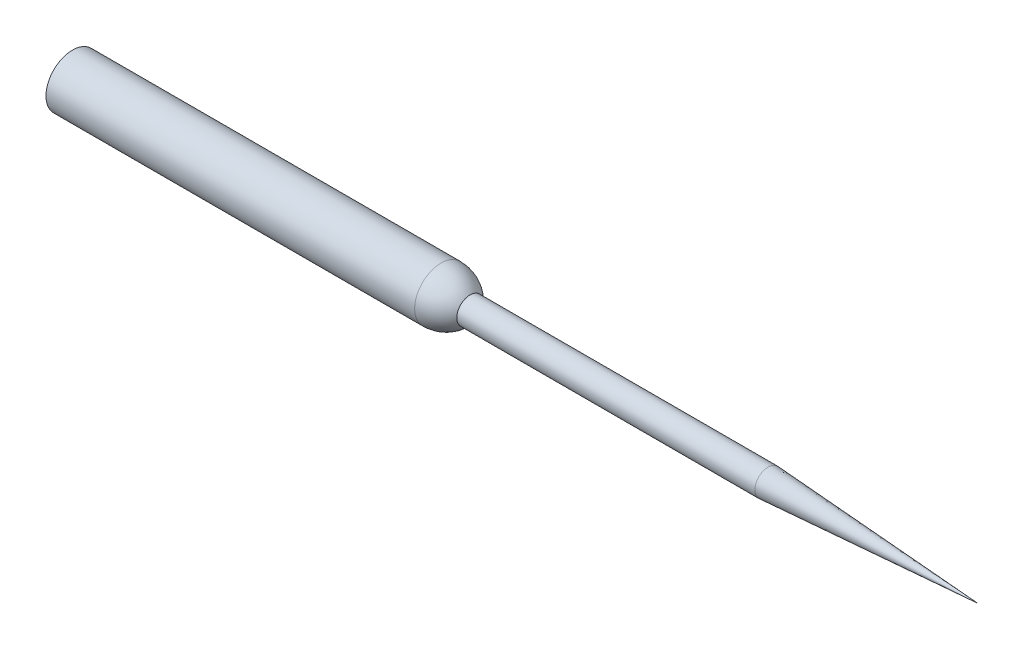
ISO-10303-21;
HEADER;
FILE_DESCRIPTION(('STEP AP214'),'2;1');
FILE_NAME('part.step','',(''),(''),'','','');
FILE_SCHEMA(('AUTOMOTIVE_DESIGN { 1 0 10303 214 1 1 1 1 }'));
ENDSEC;
DATA;
#1=APPLICATION_CONTEXT('core data for automotive mechanical design processes');
#2=APPLICATION_PROTOCOL_DEFINITION('international standard','automotive_design',2000,#1);
#3=PRODUCT_CONTEXT('',#1,'mechanical');
#4=PRODUCT('Part','Part','',(#3));
#5=PRODUCT_RELATED_PRODUCT_CATEGORY('part','',(#4));
#6=PRODUCT_DEFINITION_FORMATION('','',#4);
#7=PRODUCT_DEFINITION_CONTEXT('part definition',#1,'design');
#8=PRODUCT_DEFINITION('design','',#6,#7);
#9=PRODUCT_DEFINITION_SHAPE('','',#8);
#10=(LENGTH_UNIT() NAMED_UNIT(*) SI_UNIT(.MILLI.,.METRE.));
#11=(NAMED_UNIT(*) PLANE_ANGLE_UNIT() SI_UNIT($,.RADIAN.));
#12=(NAMED_UNIT(*) SI_UNIT($,.STERADIAN.) SOLID_ANGLE_UNIT());
#13=UNCERTAINTY_MEASURE_WITH_UNIT(LENGTH_MEASURE(1.E-05),#10,'distance_accuracy_value','');
#14=(GEOMETRIC_REPRESENTATION_CONTEXT(3) GLOBAL_UNCERTAINTY_ASSIGNED_CONTEXT((#13)) GLOBAL_UNIT_ASSIGNED_CONTEXT((#10,
#11,#12)) REPRESENTATION_CONTEXT('',''));
#15=CARTESIAN_POINT('',(0.,0.,0.));
#16=DIRECTION('',(0.,0.,1.));
#17=DIRECTION('',(1.,0.,0.));
#18=AXIS2_PLACEMENT_3D('',#15,#16,#17);
#19=CARTESIAN_POINT('',(-160.8640272988,-54.0757420675537,0.));
#20=DIRECTION('',(1.,0.,0.));
#21=DIRECTION('',(0.,0.,-1.));
#22=AXIS2_PLACEMENT_3D('',#19,#20,#21);
#23=PLANE('',#22);
#24=CARTESIAN_POINT('',(-160.8640272988,10.8151484135108,0.));
#25=DIRECTION('',(-1.,0.,0.));
#26=DIRECTION('',(0.,0.,1.));
#27=AXIS2_PLACEMENT_3D('',#24,#25,#26);
#28=CIRCLE('',#27,19.9664278403275);
#29=CARTESIAN_POINT('',(-160.8640272988,10.8151484135108,19.9664278403275));
#30=VERTEX_POINT('',#29);
#31=EDGE_CURVE('E69',#30,#30,#28,.T.);
#32=ORIENTED_EDGE('',*,*,#31,.T.);
#33=EDGE_LOOP('',(#32));
#34=FACE_BOUND('',#33,.T.);
#35=ADVANCED_FACE('F45',(#34),#23,.F.);
#36=CARTESIAN_POINT('',(363.967790218381,10.8151484135108,0.));
#37=DIRECTION('',(-1.,0.,0.));
#38=DIRECTION('',(0.,0.,1.));
#39=AXIS2_PLACEMENT_3D('',#36,#37,#38);
#40=CONICAL_SURFACE('',#39,9.98321392016377,0.0629796624329443);
#41=CARTESIAN_POINT('',(522.273039523835,10.8151484135108,0.));
#42=VERTEX_POINT('',#41);
#43=VERTEX_LOOP('',#42);
#44=FACE_BOUND('',#43,.T.);
#45=CARTESIAN_POINT('',(363.967790218381,10.8151484135108,0.));
#46=DIRECTION('',(-1.,0.,0.));
#47=DIRECTION('',(0.,0.,1.));
#48=AXIS2_PLACEMENT_3D('',#45,#46,#47);
#49=CIRCLE('',#48,9.98321392016377);
#50=CARTESIAN_POINT('',(363.967790218381,10.8151484135108,9.98321392016377));
#51=VERTEX_POINT('',#50);
#52=EDGE_CURVE('E11',#51,#51,#49,.T.);
#53=ORIENTED_EDGE('',*,*,#52,.F.);
#54=EDGE_LOOP('',(#53));
#55=FACE_BOUND('',#54,.T.);
#56=ADVANCED_FACE('F54',(#44,#55),#40,.T.);
#57=CARTESIAN_POINT('',(-160.8640272988,10.8151484135108,0.));
#58=DIRECTION('',(-1.,0.,0.));
#59=DIRECTION('',(0.,0.,1.));
#60=AXIS2_PLACEMENT_3D('',#57,#58,#59);
#61=CYLINDRICAL_SURFACE('',#60,9.98321392016377);
#62=ORIENTED_EDGE('',*,*,#52,.T.);
#63=EDGE_LOOP('',(#62));
#64=FACE_BOUND('',#63,.T.);
#65=CARTESIAN_POINT('',(139.069112251348,10.8151484135108,0.));
#66=DIRECTION('',(-1.,0.,0.));
#67=DIRECTION('',(0.,0.,1.));
#68=AXIS2_PLACEMENT_3D('',#65,#66,#67);
#69=CIRCLE('',#68,9.98321392016377);
#70=CARTESIAN_POINT('',(139.069112251348,10.8151484135108,9.98321392016377));
#71=VERTEX_POINT('',#70);
#72=EDGE_CURVE('E51',#71,#71,#69,.T.);
#73=ORIENTED_EDGE('',*,*,#72,.F.);
#74=EDGE_LOOP('',(#73));
#75=FACE_BOUND('',#74,.T.);
#76=ADVANCED_FACE('F57',(#64,#75),#61,.T.);
#77=CARTESIAN_POINT('',(117.239789048619,10.8151484135108,0.));
#78=DIRECTION('',(-1.,0.,0.));
#79=DIRECTION('',(0.,0.,1.));
#80=AXIS2_PLACEMENT_3D('',#77,#78,#79);
#81=DEGENERATE_TOROIDAL_SURFACE('',#80,8.89120840150329,28.8576362418308,.F.);
#82=ORIENTED_EDGE('',*,*,#72,.T.);
#83=EDGE_LOOP('',(#82));
#84=FACE_BOUND('',#83,.T.);
#85=CARTESIAN_POINT('',(117.239789048619,10.8151484135108,0.));
#86=DIRECTION('',(-1.,0.,0.));
#87=DIRECTION('',(0.,0.,1.));
#88=AXIS2_PLACEMENT_3D('',#85,#86,#87);
#89=CIRCLE('',#88,19.9664278403275);
#90=CARTESIAN_POINT('',(117.239789048619,10.8151484135108,19.9664278403275));
#91=VERTEX_POINT('',#90);
#92=EDGE_CURVE('E67',#91,#91,#89,.T.);
#93=ORIENTED_EDGE('',*,*,#92,.F.);
#94=EDGE_LOOP('',(#93));
#95=FACE_BOUND('',#94,.T.);
#96=ADVANCED_FACE('F62',(#84,#95),#81,.F.);
#97=CARTESIAN_POINT('',(-160.8640272988,10.8151484135108,0.));
#98=DIRECTION('',(-1.,0.,0.));
#99=DIRECTION('',(0.,0.,1.));
#100=AXIS2_PLACEMENT_3D('',#97,#98,#99);
#101=CYLINDRICAL_SURFACE('',#100,19.9664278403275);
#102=ORIENTED_EDGE('',*,*,#31,.F.);
#103=EDGE_LOOP('',(#102));
#104=FACE_BOUND('',#103,.T.);
#105=ORIENTED_EDGE('',*,*,#92,.T.);
#106=EDGE_LOOP('',(#105));
#107=FACE_BOUND('',#106,.T.);
#108=ADVANCED_FACE('F76',(#104,#107),#101,.T.);
#109=CLOSED_SHELL('',(#35,#56,#76,#96,#108));
#110=MANIFOLD_SOLID_BREP('B2',#109);
#111=ADVANCED_BREP_SHAPE_REPRESENTATION('',(#18,#110),#14);
#112=SHAPE_DEFINITION_REPRESENTATION(#9,#111);
ENDSEC;
END-ISO-10303-21;
